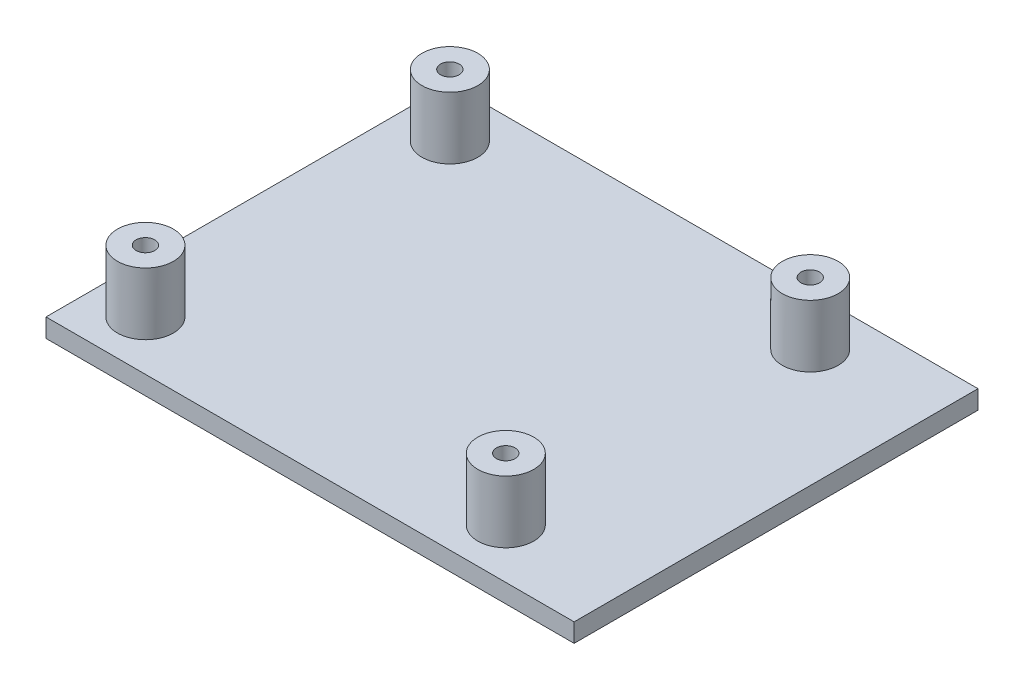
ISO-10303-21;
HEADER;
FILE_DESCRIPTION(('STEP AP214'),'2;1');
FILE_NAME('part.step','',(''),(''),'','','');
FILE_SCHEMA(('AUTOMOTIVE_DESIGN { 1 0 10303 214 1 1 1 1 }'));
ENDSEC;
DATA;
#1=APPLICATION_CONTEXT('core data for automotive mechanical design processes');
#2=APPLICATION_PROTOCOL_DEFINITION('international standard','automotive_design',2000,#1);
#3=PRODUCT_CONTEXT('',#1,'mechanical');
#4=PRODUCT('Part','Part','',(#3));
#5=PRODUCT_RELATED_PRODUCT_CATEGORY('part','',(#4));
#6=PRODUCT_DEFINITION_FORMATION('','',#4);
#7=PRODUCT_DEFINITION_CONTEXT('part definition',#1,'design');
#8=PRODUCT_DEFINITION('design','',#6,#7);
#9=PRODUCT_DEFINITION_SHAPE('','',#8);
#10=(LENGTH_UNIT() NAMED_UNIT(*) SI_UNIT(.MILLI.,.METRE.));
#11=(NAMED_UNIT(*) PLANE_ANGLE_UNIT() SI_UNIT($,.RADIAN.));
#12=(NAMED_UNIT(*) SI_UNIT($,.STERADIAN.) SOLID_ANGLE_UNIT());
#13=UNCERTAINTY_MEASURE_WITH_UNIT(LENGTH_MEASURE(1.E-05),#10,'distance_accuracy_value','');
#14=(GEOMETRIC_REPRESENTATION_CONTEXT(3) GLOBAL_UNCERTAINTY_ASSIGNED_CONTEXT((#13)) GLOBAL_UNIT_ASSIGNED_CONTEXT((#10,
#11,#12)) REPRESENTATION_CONTEXT('',''));
#15=CARTESIAN_POINT('',(0.,0.,0.));
#16=DIRECTION('',(0.,0.,1.));
#17=DIRECTION('',(1.,0.,0.));
#18=AXIS2_PLACEMENT_3D('',#15,#16,#17);
#19=CARTESIAN_POINT('',(66.,10.,-8.));
#20=DIRECTION('',(0.,1.,0.));
#21=DIRECTION('',(0.,0.,1.));
#22=AXIS2_PLACEMENT_3D('',#19,#20,#21);
#23=PLANE('',#22);
#24=CARTESIAN_POINT('',(66.,10.,-8.));
#25=DIRECTION('',(0.,1.,0.));
#26=DIRECTION('',(0.,0.,1.));
#27=AXIS2_PLACEMENT_3D('',#24,#25,#26);
#28=CIRCLE('',#27,4.5);
#29=CARTESIAN_POINT('',(66.,10.,-3.5));
#30=VERTEX_POINT('',#29);
#31=EDGE_CURVE('E142',#30,#30,#28,.T.);
#32=ORIENTED_EDGE('',*,*,#31,.T.);
#33=EDGE_LOOP('',(#32));
#34=FACE_BOUND('',#33,.T.);
#35=CARTESIAN_POINT('',(66.,10.,-8.));
#36=DIRECTION('',(0.,1.,0.));
#37=DIRECTION('',(0.,0.,1.));
#38=AXIS2_PLACEMENT_3D('',#35,#36,#37);
#39=CIRCLE('',#38,1.5);
#40=CARTESIAN_POINT('',(66.,10.,-6.5));
#41=VERTEX_POINT('',#40);
#42=EDGE_CURVE('E138',#41,#41,#39,.T.);
#43=ORIENTED_EDGE('',*,*,#42,.F.);
#44=EDGE_LOOP('',(#43));
#45=FACE_BOUND('',#44,.T.);
#46=ADVANCED_FACE('F43',(#34,#45),#23,.T.);
#47=CARTESIAN_POINT('',(66.,10.,-8.));
#48=DIRECTION('',(0.,-1.,0.));
#49=DIRECTION('',(0.,0.,-1.));
#50=AXIS2_PLACEMENT_3D('',#47,#48,#49);
#51=CYLINDRICAL_SURFACE('',#50,4.5);
#52=ORIENTED_EDGE('',*,*,#31,.F.);
#53=EDGE_LOOP('',(#52));
#54=FACE_BOUND('',#53,.T.);
#55=CARTESIAN_POINT('',(66.,0.,-8.));
#56=DIRECTION('',(0.,1.,0.));
#57=DIRECTION('',(0.,0.,1.));
#58=AXIS2_PLACEMENT_3D('',#55,#56,#57);
#59=CIRCLE('',#58,4.5);
#60=CARTESIAN_POINT('',(66.,0.,-3.5));
#61=VERTEX_POINT('',#60);
#62=EDGE_CURVE('E133',#61,#61,#59,.T.);
#63=ORIENTED_EDGE('',*,*,#62,.T.);
#64=EDGE_LOOP('',(#63));
#65=FACE_BOUND('',#64,.T.);
#66=ADVANCED_FACE('F45',(#54,#65),#51,.T.);
#67=CARTESIAN_POINT('',(66.,10.,-8.));
#68=DIRECTION('',(0.,-1.,0.));
#69=DIRECTION('',(0.,0.,-1.));
#70=AXIS2_PLACEMENT_3D('',#67,#68,#69);
#71=CYLINDRICAL_SURFACE('',#70,1.5);
#72=ORIENTED_EDGE('',*,*,#42,.T.);
#73=EDGE_LOOP('',(#72));
#74=FACE_BOUND('',#73,.T.);
#75=CARTESIAN_POINT('',(66.,0.,-8.));
#76=DIRECTION('',(0.,1.,0.));
#77=DIRECTION('',(0.,0.,1.));
#78=AXIS2_PLACEMENT_3D('',#75,#76,#77);
#79=CIRCLE('',#78,1.5);
#80=CARTESIAN_POINT('',(66.,0.,-6.5));
#81=VERTEX_POINT('',#80);
#82=EDGE_CURVE('E143',#81,#81,#79,.T.);
#83=ORIENTED_EDGE('',*,*,#82,.F.);
#84=EDGE_LOOP('',(#83));
#85=FACE_BOUND('',#84,.T.);
#86=ADVANCED_FACE('F189',(#74,#85),#71,.F.);
#87=CARTESIAN_POINT('',(0.,0.,0.));
#88=DIRECTION('',(0.,-1.,0.));
#89=DIRECTION('',(0.,0.,-1.));
#90=AXIS2_PLACEMENT_3D('',#87,#88,#89);
#91=PLANE('',#90);
#92=ORIENTED_EDGE('',*,*,#82,.T.);
#93=EDGE_LOOP('',(#92));
#94=FACE_BOUND('',#93,.T.);
#95=ADVANCED_FACE('F169',(#94),#91,.F.);
#96=CARTESIAN_POINT('',(0.,-3.,0.));
#97=DIRECTION('',(-1.,0.,0.));
#98=DIRECTION('',(0.,0.,1.));
#99=AXIS2_PLACEMENT_3D('',#96,#97,#98);
#100=PLANE('',#99);
#101=DIRECTION('',(0.,0.,1.));
#102=VECTOR('',#101,1.);
#103=CARTESIAN_POINT('',(0.,0.,0.));
#104=LINE('',#103,#102);
#105=CARTESIAN_POINT('',(0.,0.,-65.));
#106=VERTEX_POINT('',#105);
#107=CARTESIAN_POINT('',(0.,0.,0.));
#108=VERTEX_POINT('',#107);
#109=EDGE_CURVE('E118',#106,#108,#104,.T.);
#110=ORIENTED_EDGE('',*,*,#109,.F.);
#111=DIRECTION('',(0.,1.,0.));
#112=VECTOR('',#111,1.);
#113=CARTESIAN_POINT('',(0.,-3.,-65.));
#114=LINE('',#113,#112);
#115=CARTESIAN_POINT('',(0.,-3.,-65.));
#116=VERTEX_POINT('',#115);
#117=EDGE_CURVE('E61',#116,#106,#114,.T.);
#118=ORIENTED_EDGE('',*,*,#117,.F.);
#119=DIRECTION('',(0.,0.,1.));
#120=VECTOR('',#119,1.);
#121=CARTESIAN_POINT('',(0.,-3.,0.));
#122=LINE('',#121,#120);
#123=CARTESIAN_POINT('',(0.,-3.,0.));
#124=VERTEX_POINT('',#123);
#125=EDGE_CURVE('E109',#116,#124,#122,.T.);
#126=ORIENTED_EDGE('',*,*,#125,.T.);
#127=DIRECTION('',(0.,1.,0.));
#128=VECTOR('',#127,1.);
#129=CARTESIAN_POINT('',(0.,-3.,0.));
#130=LINE('',#129,#128);
#131=EDGE_CURVE('E89',#124,#108,#130,.T.);
#132=ORIENTED_EDGE('',*,*,#131,.T.);
#133=EDGE_LOOP('',(#110,#118,#126,#132));
#134=FACE_BOUND('',#133,.T.);
#135=ADVANCED_FACE('F174',(#134),#100,.T.);
#136=CARTESIAN_POINT('',(0.,-3.,-65.));
#137=DIRECTION('',(0.,0.,-1.));
#138=DIRECTION('',(-1.,0.,0.));
#139=AXIS2_PLACEMENT_3D('',#136,#137,#138);
#140=PLANE('',#139);
#141=DIRECTION('',(-1.,0.,0.));
#142=VECTOR('',#141,1.);
#143=CARTESIAN_POINT('',(0.,0.,-65.));
#144=LINE('',#143,#142);
#145=CARTESIAN_POINT('',(85.,0.,-65.));
#146=VERTEX_POINT('',#145);
#147=EDGE_CURVE('E112',#146,#106,#144,.T.);
#148=ORIENTED_EDGE('',*,*,#147,.F.);
#149=DIRECTION('',(0.,1.,0.));
#150=VECTOR('',#149,1.);
#151=CARTESIAN_POINT('',(85.,-3.,-65.));
#152=LINE('',#151,#150);
#153=CARTESIAN_POINT('',(85.,-3.,-65.));
#154=VERTEX_POINT('',#153);
#155=EDGE_CURVE('E78',#154,#146,#152,.T.);
#156=ORIENTED_EDGE('',*,*,#155,.F.);
#157=DIRECTION('',(-1.,0.,0.));
#158=VECTOR('',#157,1.);
#159=CARTESIAN_POINT('',(0.,-3.,-65.));
#160=LINE('',#159,#158);
#161=EDGE_CURVE('E104',#154,#116,#160,.T.);
#162=ORIENTED_EDGE('',*,*,#161,.T.);
#163=ORIENTED_EDGE('',*,*,#117,.T.);
#164=EDGE_LOOP('',(#148,#156,#162,#163));
#165=FACE_BOUND('',#164,.T.);
#166=ADVANCED_FACE('F175',(#165),#140,.T.);
#167=CARTESIAN_POINT('',(85.,-3.,0.));
#168=DIRECTION('',(1.,0.,0.));
#169=DIRECTION('',(0.,0.,-1.));
#170=AXIS2_PLACEMENT_3D('',#167,#168,#169);
#171=PLANE('',#170);
#172=DIRECTION('',(0.,0.,-1.));
#173=VECTOR('',#172,1.);
#174=CARTESIAN_POINT('',(85.,0.,0.));
#175=LINE('',#174,#173);
#176=CARTESIAN_POINT('',(85.,0.,0.));
#177=VERTEX_POINT('',#176);
#178=EDGE_CURVE('E97',#177,#146,#175,.T.);
#179=ORIENTED_EDGE('',*,*,#178,.F.);
#180=DIRECTION('',(0.,1.,0.));
#181=VECTOR('',#180,1.);
#182=CARTESIAN_POINT('',(85.,-3.,0.));
#183=LINE('',#182,#181);
#184=CARTESIAN_POINT('',(85.,-3.,0.));
#185=VERTEX_POINT('',#184);
#186=EDGE_CURVE('E92',#185,#177,#183,.T.);
#187=ORIENTED_EDGE('',*,*,#186,.F.);
#188=DIRECTION('',(0.,0.,-1.));
#189=VECTOR('',#188,1.);
#190=CARTESIAN_POINT('',(85.,-3.,0.));
#191=LINE('',#190,#189);
#192=EDGE_CURVE('E95',#185,#154,#191,.T.);
#193=ORIENTED_EDGE('',*,*,#192,.T.);
#194=ORIENTED_EDGE('',*,*,#155,.T.);
#195=EDGE_LOOP('',(#179,#187,#193,#194));
#196=FACE_BOUND('',#195,.T.);
#197=ADVANCED_FACE('F94',(#196),#171,.T.);
#198=CARTESIAN_POINT('',(0.,-3.,0.));
#199=DIRECTION('',(0.,0.,1.));
#200=DIRECTION('',(1.,0.,0.));
#201=AXIS2_PLACEMENT_3D('',#198,#199,#200);
#202=PLANE('',#201);
#203=DIRECTION('',(1.,0.,0.));
#204=VECTOR('',#203,1.);
#205=CARTESIAN_POINT('',(0.,0.,0.));
#206=LINE('',#205,#204);
#207=EDGE_CURVE('E122',#108,#177,#206,.T.);
#208=ORIENTED_EDGE('',*,*,#207,.F.);
#209=ORIENTED_EDGE('',*,*,#131,.F.);
#210=DIRECTION('',(1.,0.,0.));
#211=VECTOR('',#210,1.);
#212=CARTESIAN_POINT('',(0.,-3.,0.));
#213=LINE('',#212,#211);
#214=EDGE_CURVE('E103',#124,#185,#213,.T.);
#215=ORIENTED_EDGE('',*,*,#214,.T.);
#216=ORIENTED_EDGE('',*,*,#186,.T.);
#217=EDGE_LOOP('',(#208,#209,#215,#216));
#218=FACE_BOUND('',#217,.T.);
#219=ADVANCED_FACE('F107',(#218),#202,.T.);
#220=CARTESIAN_POINT('',(0.,-3.,0.));
#221=DIRECTION('',(0.,-1.,0.));
#222=DIRECTION('',(0.,0.,-1.));
#223=AXIS2_PLACEMENT_3D('',#220,#221,#222);
#224=PLANE('',#223);
#225=ORIENTED_EDGE('',*,*,#125,.F.);
#226=ORIENTED_EDGE('',*,*,#161,.F.);
#227=ORIENTED_EDGE('',*,*,#192,.F.);
#228=ORIENTED_EDGE('',*,*,#214,.F.);
#229=EDGE_LOOP('',(#225,#226,#227,#228));
#230=FACE_BOUND('',#229,.T.);
#231=ADVANCED_FACE('F102',(#230),#224,.T.);
#232=CARTESIAN_POINT('',(8.00000000000001,0.,-8.));
#233=DIRECTION('',(0.,-1.,0.));
#234=DIRECTION('',(0.,0.,-1.));
#235=AXIS2_PLACEMENT_3D('',#232,#233,#234);
#236=CIRCLE('',#235,4.5);
#237=CARTESIAN_POINT('',(8.00000000000001,0.,-12.5));
#238=VERTEX_POINT('',#237);
#239=EDGE_CURVE('E11',#238,#238,#236,.F.);
#240=ORIENTED_EDGE('',*,*,#239,.F.);
#241=EDGE_LOOP('',(#240));
#242=FACE_BOUND('',#241,.T.);
#243=CARTESIAN_POINT('',(8.,0.,-57.));
#244=DIRECTION('',(0.,-1.,0.));
#245=DIRECTION('',(0.,0.,-1.));
#246=AXIS2_PLACEMENT_3D('',#243,#244,#245);
#247=CIRCLE('',#246,4.5);
#248=CARTESIAN_POINT('',(8.,0.,-61.5));
#249=VERTEX_POINT('',#248);
#250=EDGE_CURVE('E53',#249,#249,#247,.F.);
#251=ORIENTED_EDGE('',*,*,#250,.F.);
#252=EDGE_LOOP('',(#251));
#253=FACE_BOUND('',#252,.T.);
#254=CARTESIAN_POINT('',(66.,0.,-57.));
#255=DIRECTION('',(0.,-1.,0.));
#256=DIRECTION('',(0.,0.,-1.));
#257=AXIS2_PLACEMENT_3D('',#254,#255,#256);
#258=CIRCLE('',#257,4.50000000000001);
#259=CARTESIAN_POINT('',(66.,0.,-61.5));
#260=VERTEX_POINT('',#259);
#261=EDGE_CURVE('E150',#260,#260,#258,.F.);
#262=ORIENTED_EDGE('',*,*,#261,.F.);
#263=EDGE_LOOP('',(#262));
#264=FACE_BOUND('',#263,.T.);
#265=ORIENTED_EDGE('',*,*,#62,.F.);
#266=EDGE_LOOP('',(#265));
#267=FACE_BOUND('',#266,.T.);
#268=ORIENTED_EDGE('',*,*,#109,.T.);
#269=ORIENTED_EDGE('',*,*,#207,.T.);
#270=ORIENTED_EDGE('',*,*,#178,.T.);
#271=ORIENTED_EDGE('',*,*,#147,.T.);
#272=EDGE_LOOP('',(#268,#269,#270,#271));
#273=FACE_BOUND('',#272,.T.);
#274=ADVANCED_FACE('F162',(#242,#253,#264,#267,#273),#91,.F.);
#275=CARTESIAN_POINT('',(66.,10.,-57.));
#276=DIRECTION('',(0.,1.,0.));
#277=DIRECTION('',(0.,0.,1.));
#278=AXIS2_PLACEMENT_3D('',#275,#276,#277);
#279=PLANE('',#278);
#280=CARTESIAN_POINT('',(66.,10.,-57.));
#281=DIRECTION('',(0.,1.,0.));
#282=DIRECTION('',(0.,0.,1.));
#283=AXIS2_PLACEMENT_3D('',#280,#281,#282);
#284=CIRCLE('',#283,4.50000000000001);
#285=CARTESIAN_POINT('',(66.,10.,-52.5));
#286=VERTEX_POINT('',#285);
#287=EDGE_CURVE('E266',#286,#286,#284,.T.);
#288=ORIENTED_EDGE('',*,*,#287,.T.);
#289=EDGE_LOOP('',(#288));
#290=FACE_BOUND('',#289,.T.);
#291=CARTESIAN_POINT('',(66.,10.,-57.));
#292=DIRECTION('',(0.,1.,0.));
#293=DIRECTION('',(0.,0.,1.));
#294=AXIS2_PLACEMENT_3D('',#291,#292,#293);
#295=CIRCLE('',#294,1.5);
#296=CARTESIAN_POINT('',(66.,10.,-55.5));
#297=VERTEX_POINT('',#296);
#298=EDGE_CURVE('E273',#297,#297,#295,.T.);
#299=ORIENTED_EDGE('',*,*,#298,.F.);
#300=EDGE_LOOP('',(#299));
#301=FACE_BOUND('',#300,.T.);
#302=ADVANCED_FACE('F165',(#290,#301),#279,.T.);
#303=CARTESIAN_POINT('',(66.,10.,-57.));
#304=DIRECTION('',(0.,-1.,0.));
#305=DIRECTION('',(0.,0.,-1.));
#306=AXIS2_PLACEMENT_3D('',#303,#304,#305);
#307=CYLINDRICAL_SURFACE('',#306,4.50000000000001);
#308=ORIENTED_EDGE('',*,*,#287,.F.);
#309=EDGE_LOOP('',(#308));
#310=FACE_BOUND('',#309,.T.);
#311=ORIENTED_EDGE('',*,*,#261,.T.);
#312=EDGE_LOOP('',(#311));
#313=FACE_BOUND('',#312,.T.);
#314=ADVANCED_FACE('F208',(#310,#313),#307,.T.);
#315=CARTESIAN_POINT('',(66.,10.,-57.));
#316=DIRECTION('',(0.,-1.,0.));
#317=DIRECTION('',(0.,0.,-1.));
#318=AXIS2_PLACEMENT_3D('',#315,#316,#317);
#319=CYLINDRICAL_SURFACE('',#318,1.5);
#320=ORIENTED_EDGE('',*,*,#298,.T.);
#321=EDGE_LOOP('',(#320));
#322=FACE_BOUND('',#321,.T.);
#323=CARTESIAN_POINT('',(66.,0.,-57.));
#324=DIRECTION('',(0.,1.,0.));
#325=DIRECTION('',(0.,0.,1.));
#326=AXIS2_PLACEMENT_3D('',#323,#324,#325);
#327=CIRCLE('',#326,1.5);
#328=CARTESIAN_POINT('',(66.,0.,-55.5));
#329=VERTEX_POINT('',#328);
#330=EDGE_CURVE('E123',#329,#329,#327,.T.);
#331=ORIENTED_EDGE('',*,*,#330,.F.);
#332=EDGE_LOOP('',(#331));
#333=FACE_BOUND('',#332,.T.);
#334=ADVANCED_FACE('F204',(#322,#333),#319,.F.);
#335=ORIENTED_EDGE('',*,*,#330,.T.);
#336=EDGE_LOOP('',(#335));
#337=FACE_BOUND('',#336,.T.);
#338=ADVANCED_FACE('F207',(#337),#91,.F.);
#339=CARTESIAN_POINT('',(8.,10.,-57.));
#340=DIRECTION('',(0.,1.,0.));
#341=DIRECTION('',(0.,0.,1.));
#342=AXIS2_PLACEMENT_3D('',#339,#340,#341);
#343=PLANE('',#342);
#344=CARTESIAN_POINT('',(8.,10.,-57.));
#345=DIRECTION('',(0.,1.,0.));
#346=DIRECTION('',(0.,0.,1.));
#347=AXIS2_PLACEMENT_3D('',#344,#345,#346);
#348=CIRCLE('',#347,4.5);
#349=CARTESIAN_POINT('',(8.,10.,-52.5));
#350=VERTEX_POINT('',#349);
#351=EDGE_CURVE('E256',#350,#350,#348,.T.);
#352=ORIENTED_EDGE('',*,*,#351,.T.);
#353=EDGE_LOOP('',(#352));
#354=FACE_BOUND('',#353,.T.);
#355=CARTESIAN_POINT('',(8.,10.,-57.));
#356=DIRECTION('',(0.,1.,0.));
#357=DIRECTION('',(0.,0.,1.));
#358=AXIS2_PLACEMENT_3D('',#355,#356,#357);
#359=CIRCLE('',#358,1.5);
#360=CARTESIAN_POINT('',(8.,10.,-55.5));
#361=VERTEX_POINT('',#360);
#362=EDGE_CURVE('E261',#361,#361,#359,.T.);
#363=ORIENTED_EDGE('',*,*,#362,.F.);
#364=EDGE_LOOP('',(#363));
#365=FACE_BOUND('',#364,.T.);
#366=ADVANCED_FACE('F221',(#354,#365),#343,.T.);
#367=CARTESIAN_POINT('',(8.,10.,-57.));
#368=DIRECTION('',(0.,-1.,0.));
#369=DIRECTION('',(0.,0.,-1.));
#370=AXIS2_PLACEMENT_3D('',#367,#368,#369);
#371=CYLINDRICAL_SURFACE('',#370,4.5);
#372=ORIENTED_EDGE('',*,*,#351,.F.);
#373=EDGE_LOOP('',(#372));
#374=FACE_BOUND('',#373,.T.);
#375=ORIENTED_EDGE('',*,*,#250,.T.);
#376=EDGE_LOOP('',(#375));
#377=FACE_BOUND('',#376,.T.);
#378=ADVANCED_FACE('F160',(#374,#377),#371,.T.);
#379=CARTESIAN_POINT('',(8.,10.,-57.));
#380=DIRECTION('',(0.,-1.,0.));
#381=DIRECTION('',(0.,0.,-1.));
#382=AXIS2_PLACEMENT_3D('',#379,#380,#381);
#383=CYLINDRICAL_SURFACE('',#382,1.5);
#384=ORIENTED_EDGE('',*,*,#362,.T.);
#385=EDGE_LOOP('',(#384));
#386=FACE_BOUND('',#385,.T.);
#387=CARTESIAN_POINT('',(8.,0.,-57.));
#388=DIRECTION('',(0.,1.,0.));
#389=DIRECTION('',(0.,0.,1.));
#390=AXIS2_PLACEMENT_3D('',#387,#388,#389);
#391=CIRCLE('',#390,1.5);
#392=CARTESIAN_POINT('',(8.,0.,-55.5));
#393=VERTEX_POINT('',#392);
#394=EDGE_CURVE('E262',#393,#393,#391,.T.);
#395=ORIENTED_EDGE('',*,*,#394,.F.);
#396=EDGE_LOOP('',(#395));
#397=FACE_BOUND('',#396,.T.);
#398=ADVANCED_FACE('F216',(#386,#397),#383,.F.);
#399=ORIENTED_EDGE('',*,*,#394,.T.);
#400=EDGE_LOOP('',(#399));
#401=FACE_BOUND('',#400,.T.);
#402=ADVANCED_FACE('F219',(#401),#91,.F.);
#403=CARTESIAN_POINT('',(8.00000000000001,10.,-8.));
#404=DIRECTION('',(0.,1.,0.));
#405=DIRECTION('',(0.,0.,1.));
#406=AXIS2_PLACEMENT_3D('',#403,#404,#405);
#407=PLANE('',#406);
#408=CARTESIAN_POINT('',(8.00000000000001,10.,-8.));
#409=DIRECTION('',(0.,1.,0.));
#410=DIRECTION('',(0.,0.,1.));
#411=AXIS2_PLACEMENT_3D('',#408,#409,#410);
#412=CIRCLE('',#411,4.5);
#413=CARTESIAN_POINT('',(8.00000000000001,10.,-3.5));
#414=VERTEX_POINT('',#413);
#415=EDGE_CURVE('E244',#414,#414,#412,.T.);
#416=ORIENTED_EDGE('',*,*,#415,.T.);
#417=EDGE_LOOP('',(#416));
#418=FACE_BOUND('',#417,.T.);
#419=CARTESIAN_POINT('',(8.00000000000001,10.,-8.));
#420=DIRECTION('',(0.,1.,0.));
#421=DIRECTION('',(0.,0.,1.));
#422=AXIS2_PLACEMENT_3D('',#419,#420,#421);
#423=CIRCLE('',#422,1.5);
#424=CARTESIAN_POINT('',(8.00000000000001,10.,-6.5));
#425=VERTEX_POINT('',#424);
#426=EDGE_CURVE('E247',#425,#425,#423,.T.);
#427=ORIENTED_EDGE('',*,*,#426,.F.);
#428=EDGE_LOOP('',(#427));
#429=FACE_BOUND('',#428,.T.);
#430=ADVANCED_FACE('F233',(#418,#429),#407,.T.);
#431=CARTESIAN_POINT('',(8.00000000000001,10.,-8.));
#432=DIRECTION('',(0.,-1.,0.));
#433=DIRECTION('',(0.,0.,-1.));
#434=AXIS2_PLACEMENT_3D('',#431,#432,#433);
#435=CYLINDRICAL_SURFACE('',#434,4.5);
#436=ORIENTED_EDGE('',*,*,#415,.F.);
#437=EDGE_LOOP('',(#436));
#438=FACE_BOUND('',#437,.T.);
#439=ORIENTED_EDGE('',*,*,#239,.T.);
#440=EDGE_LOOP('',(#439));
#441=FACE_BOUND('',#440,.T.);
#442=ADVANCED_FACE('F231',(#438,#441),#435,.T.);
#443=CARTESIAN_POINT('',(8.00000000000001,10.,-8.));
#444=DIRECTION('',(0.,-1.,0.));
#445=DIRECTION('',(0.,0.,-1.));
#446=AXIS2_PLACEMENT_3D('',#443,#444,#445);
#447=CYLINDRICAL_SURFACE('',#446,1.5);
#448=ORIENTED_EDGE('',*,*,#426,.T.);
#449=EDGE_LOOP('',(#448));
#450=FACE_BOUND('',#449,.T.);
#451=CARTESIAN_POINT('',(8.00000000000001,0.,-8.));
#452=DIRECTION('',(0.,1.,0.));
#453=DIRECTION('',(0.,0.,1.));
#454=AXIS2_PLACEMENT_3D('',#451,#452,#453);
#455=CIRCLE('',#454,1.5);
#456=CARTESIAN_POINT('',(8.00000000000001,0.,-6.5));
#457=VERTEX_POINT('',#456);
#458=EDGE_CURVE('E251',#457,#457,#455,.T.);
#459=ORIENTED_EDGE('',*,*,#458,.F.);
#460=EDGE_LOOP('',(#459));
#461=FACE_BOUND('',#460,.T.);
#462=ADVANCED_FACE('F228',(#450,#461),#447,.F.);
#463=ORIENTED_EDGE('',*,*,#458,.T.);
#464=EDGE_LOOP('',(#463));
#465=FACE_BOUND('',#464,.T.);
#466=ADVANCED_FACE('F168',(#465),#91,.F.);
#467=CLOSED_SHELL('',(#46,#66,#86,#95,#135,#166,#197,#219,#231,#274,#302,#314,#334,#338,#366,
#378,#398,#402,#430,#442,#462,#466));
#468=MANIFOLD_SOLID_BREP('B2',#467);
#469=ADVANCED_BREP_SHAPE_REPRESENTATION('',(#18,#468),#14);
#470=SHAPE_DEFINITION_REPRESENTATION(#9,#469);
ENDSEC;
END-ISO-10303-21;
